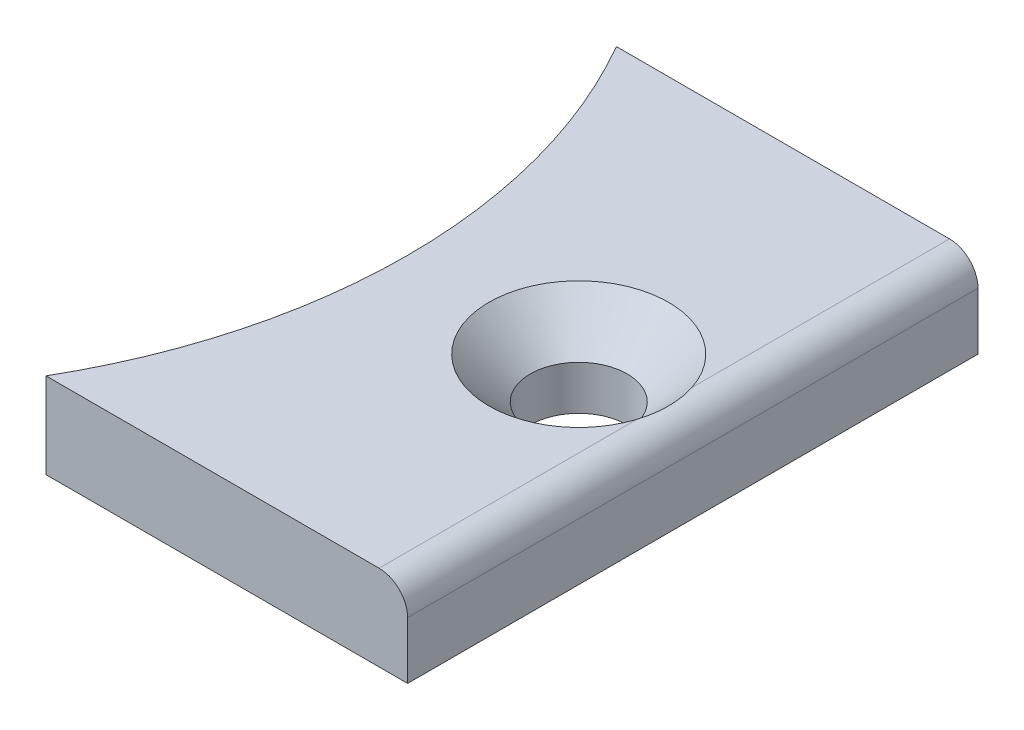
ISO-10303-21;
HEADER;
FILE_DESCRIPTION(('STEP AP214'),'2;1');
FILE_NAME('part.step','',(''),(''),'','','');
FILE_SCHEMA(('AUTOMOTIVE_DESIGN { 1 0 10303 214 1 1 1 1 }'));
ENDSEC;
DATA;
#1=APPLICATION_CONTEXT('core data for automotive mechanical design processes');
#2=APPLICATION_PROTOCOL_DEFINITION('international standard','automotive_design',2000,#1);
#3=PRODUCT_CONTEXT('',#1,'mechanical');
#4=PRODUCT('Part','Part','',(#3));
#5=PRODUCT_RELATED_PRODUCT_CATEGORY('part','',(#4));
#6=PRODUCT_DEFINITION_FORMATION('','',#4);
#7=PRODUCT_DEFINITION_CONTEXT('part definition',#1,'design');
#8=PRODUCT_DEFINITION('design','',#6,#7);
#9=PRODUCT_DEFINITION_SHAPE('','',#8);
#10=(LENGTH_UNIT() NAMED_UNIT(*) SI_UNIT(.MILLI.,.METRE.));
#11=(NAMED_UNIT(*) PLANE_ANGLE_UNIT() SI_UNIT($,.RADIAN.));
#12=(NAMED_UNIT(*) SI_UNIT($,.STERADIAN.) SOLID_ANGLE_UNIT());
#13=UNCERTAINTY_MEASURE_WITH_UNIT(LENGTH_MEASURE(1.E-05),#10,'distance_accuracy_value','');
#14=(GEOMETRIC_REPRESENTATION_CONTEXT(3) GLOBAL_UNCERTAINTY_ASSIGNED_CONTEXT((#13)) GLOBAL_UNIT_ASSIGNED_CONTEXT((#10,
#11,#12)) REPRESENTATION_CONTEXT('',''));
#15=CARTESIAN_POINT('',(0.,0.,0.));
#16=DIRECTION('',(0.,0.,1.));
#17=DIRECTION('',(1.,0.,0.));
#18=AXIS2_PLACEMENT_3D('',#15,#16,#17);
#19=CARTESIAN_POINT('',(-12.6794919243112,3.00000000000006,-10.));
#20=DIRECTION('',(0.,0.,1.));
#21=DIRECTION('',(1.,0.,0.));
#22=AXIS2_PLACEMENT_3D('',#19,#20,#21);
#23=PLANE('',#22);
#24=DIRECTION('',(-1.,0.,0.));
#25=VECTOR('',#24,1.);
#26=CARTESIAN_POINT('',(-12.6794919243112,3.00000000000006,-10.));
#27=LINE('',#26,#25);
#28=CARTESIAN_POINT('',(-0.999999999999973,3.,-10.));
#29=VERTEX_POINT('',#28);
#30=CARTESIAN_POINT('',(-12.6794919243112,3.00000000000006,-10.));
#31=VERTEX_POINT('',#30);
#32=EDGE_CURVE('E85',#29,#31,#27,.T.);
#33=ORIENTED_EDGE('',*,*,#32,.F.);
#34=CARTESIAN_POINT('',(-1.,2.,-10.));
#35=DIRECTION('',(0.,0.,1.));
#36=DIRECTION('',(1.,0.,0.));
#37=AXIS2_PLACEMENT_3D('',#34,#35,#36);
#38=CIRCLE('',#37,1.);
#39=CARTESIAN_POINT('',(0.,2.,-10.));
#40=VERTEX_POINT('',#39);
#41=EDGE_CURVE('E57',#29,#40,#38,.F.);
#42=ORIENTED_EDGE('',*,*,#41,.T.);
#43=DIRECTION('',(0.,-1.,0.));
#44=VECTOR('',#43,1.);
#45=CARTESIAN_POINT('',(0.,3.,-10.));
#46=LINE('',#45,#44);
#47=CARTESIAN_POINT('',(0.,0.,-10.));
#48=VERTEX_POINT('',#47);
#49=EDGE_CURVE('E210',#40,#48,#46,.T.);
#50=ORIENTED_EDGE('',*,*,#49,.T.);
#51=DIRECTION('',(-1.,0.,0.));
#52=VECTOR('',#51,1.);
#53=CARTESIAN_POINT('',(-12.6794919243112,0.,-10.));
#54=LINE('',#53,#52);
#55=CARTESIAN_POINT('',(-12.6794919243112,0.,-10.));
#56=VERTEX_POINT('',#55);
#57=EDGE_CURVE('E108',#48,#56,#54,.T.);
#58=ORIENTED_EDGE('',*,*,#57,.T.);
#59=DIRECTION('',(0.,-1.,0.));
#60=VECTOR('',#59,1.);
#61=CARTESIAN_POINT('',(-12.6794919243112,3.00000000000006,-10.));
#62=LINE('',#61,#60);
#63=EDGE_CURVE('E100',#31,#56,#62,.T.);
#64=ORIENTED_EDGE('',*,*,#63,.F.);
#65=EDGE_LOOP('',(#33,#42,#50,#58,#64));
#66=FACE_BOUND('',#65,.T.);
#67=ADVANCED_FACE('F34',(#66),#23,.F.);
#68=CARTESIAN_POINT('',(-30.,3.,0.));
#69=DIRECTION('',(0.,-1.,0.));
#70=DIRECTION('',(0.,0.,-1.));
#71=AXIS2_PLACEMENT_3D('',#68,#69,#70);
#72=CYLINDRICAL_SURFACE('',#71,20.);
#73=CARTESIAN_POINT('',(-30.,0.,0.));
#74=DIRECTION('',(0.,-1.,0.));
#75=DIRECTION('',(0.,0.,1.));
#76=AXIS2_PLACEMENT_3D('',#73,#74,#75);
#77=CIRCLE('',#76,20.);
#78=CARTESIAN_POINT('',(-12.6794919243112,0.,10.));
#79=VERTEX_POINT('',#78);
#80=EDGE_CURVE('E215',#56,#79,#77,.T.);
#81=ORIENTED_EDGE('',*,*,#80,.T.);
#82=DIRECTION('',(0.,-1.,0.));
#83=VECTOR('',#82,1.);
#84=CARTESIAN_POINT('',(-12.6794919243112,2.99999999999995,10.));
#85=LINE('',#84,#83);
#86=CARTESIAN_POINT('',(-12.6794919243112,2.99999999999995,10.));
#87=VERTEX_POINT('',#86);
#88=EDGE_CURVE('E103',#87,#79,#85,.T.);
#89=ORIENTED_EDGE('',*,*,#88,.F.);
#90=CARTESIAN_POINT('',(-30.,3.,0.));
#91=DIRECTION('',(0.,-1.,0.));
#92=DIRECTION('',(0.,0.,1.));
#93=AXIS2_PLACEMENT_3D('',#90,#91,#92);
#94=CIRCLE('',#93,20.);
#95=EDGE_CURVE('E89',#31,#87,#94,.T.);
#96=ORIENTED_EDGE('',*,*,#95,.F.);
#97=ORIENTED_EDGE('',*,*,#63,.T.);
#98=EDGE_LOOP('',(#81,#89,#96,#97));
#99=FACE_BOUND('',#98,.T.);
#100=ADVANCED_FACE('F99',(#99),#72,.F.);
#101=CARTESIAN_POINT('',(0.,3.,10.));
#102=DIRECTION('',(0.,0.,-1.));
#103=DIRECTION('',(-1.,0.,0.));
#104=AXIS2_PLACEMENT_3D('',#101,#102,#103);
#105=PLANE('',#104);
#106=DIRECTION('',(0.,-1.,0.));
#107=VECTOR('',#106,1.);
#108=CARTESIAN_POINT('',(0.,3.,10.));
#109=LINE('',#108,#107);
#110=CARTESIAN_POINT('',(0.,2.,10.));
#111=VERTEX_POINT('',#110);
#112=CARTESIAN_POINT('',(0.,0.,10.));
#113=VERTEX_POINT('',#112);
#114=EDGE_CURVE('E112',#111,#113,#109,.T.);
#115=ORIENTED_EDGE('',*,*,#114,.F.);
#116=CARTESIAN_POINT('',(-1.,2.,10.));
#117=DIRECTION('',(0.,0.,-1.));
#118=DIRECTION('',(-1.,0.,0.));
#119=AXIS2_PLACEMENT_3D('',#116,#117,#118);
#120=CIRCLE('',#119,1.);
#121=CARTESIAN_POINT('',(-1.,3.,10.));
#122=VERTEX_POINT('',#121);
#123=EDGE_CURVE('E11',#111,#122,#120,.F.);
#124=ORIENTED_EDGE('',*,*,#123,.T.);
#125=DIRECTION('',(1.,0.,0.));
#126=VECTOR('',#125,1.);
#127=CARTESIAN_POINT('',(0.,3.,10.));
#128=LINE('',#127,#126);
#129=EDGE_CURVE('E105',#87,#122,#128,.T.);
#130=ORIENTED_EDGE('',*,*,#129,.F.);
#131=ORIENTED_EDGE('',*,*,#88,.T.);
#132=DIRECTION('',(1.,0.,0.));
#133=VECTOR('',#132,1.);
#134=CARTESIAN_POINT('',(0.,0.,10.));
#135=LINE('',#134,#133);
#136=EDGE_CURVE('E218',#79,#113,#135,.T.);
#137=ORIENTED_EDGE('',*,*,#136,.T.);
#138=EDGE_LOOP('',(#115,#124,#130,#131,#137));
#139=FACE_BOUND('',#138,.T.);
#140=ADVANCED_FACE('F142',(#139),#105,.F.);
#141=CARTESIAN_POINT('',(0.,3.,-10.));
#142=DIRECTION('',(-1.,0.,0.));
#143=DIRECTION('',(0.,0.,1.));
#144=AXIS2_PLACEMENT_3D('',#141,#142,#143);
#145=PLANE('',#144);
#146=ORIENTED_EDGE('',*,*,#49,.F.);
#147=DIRECTION('',(0.,0.,-1.));
#148=VECTOR('',#147,1.);
#149=CARTESIAN_POINT('',(0.,2.,10.));
#150=LINE('',#149,#148);
#151=EDGE_CURVE('E43',#40,#111,#150,.F.);
#152=ORIENTED_EDGE('',*,*,#151,.T.);
#153=ORIENTED_EDGE('',*,*,#114,.T.);
#154=DIRECTION('',(0.,0.,-1.));
#155=VECTOR('',#154,1.);
#156=CARTESIAN_POINT('',(0.,0.,-10.));
#157=LINE('',#156,#155);
#158=EDGE_CURVE('E95',#113,#48,#157,.T.);
#159=ORIENTED_EDGE('',*,*,#158,.T.);
#160=EDGE_LOOP('',(#146,#152,#153,#159));
#161=FACE_BOUND('',#160,.T.);
#162=ADVANCED_FACE('F136',(#161),#145,.F.);
#163=CARTESIAN_POINT('',(-30.,3.,0.));
#164=DIRECTION('',(0.,1.,0.));
#165=DIRECTION('',(0.,0.,1.));
#166=AXIS2_PLACEMENT_3D('',#163,#164,#165);
#167=PLANE('',#166);
#168=ORIENTED_EDGE('',*,*,#129,.T.);
#169=DIRECTION('',(0.,0.,-1.));
#170=VECTOR('',#169,1.);
#171=CARTESIAN_POINT('',(-0.999999999999973,3.,-10.));
#172=LINE('',#171,#170);
#173=CARTESIAN_POINT('',(-1.,3.,0.960468635614932));
#174=VERTEX_POINT('',#173);
#175=EDGE_CURVE('E110',#122,#174,#172,.T.);
#176=ORIENTED_EDGE('',*,*,#175,.T.);
#177=CARTESIAN_POINT('',(-4.,2.99999999999995,0.));
#178=DIRECTION('',(0.,1.,0.));
#179=DIRECTION('',(0.,0.,1.));
#180=AXIS2_PLACEMENT_3D('',#177,#178,#179);
#181=CIRCLE('',#180,3.15);
#182=CARTESIAN_POINT('',(-1.,3.,-0.960468635614934));
#183=VERTEX_POINT('',#182);
#184=EDGE_CURVE('E229',#183,#174,#181,.T.);
#185=ORIENTED_EDGE('',*,*,#184,.F.);
#186=DIRECTION('',(0.,0.,-1.));
#187=VECTOR('',#186,1.);
#188=CARTESIAN_POINT('',(-0.999999999999973,3.,-10.));
#189=LINE('',#188,#187);
#190=EDGE_CURVE('E93',#183,#29,#189,.T.);
#191=ORIENTED_EDGE('',*,*,#190,.T.);
#192=ORIENTED_EDGE('',*,*,#32,.T.);
#193=ORIENTED_EDGE('',*,*,#95,.T.);
#194=EDGE_LOOP('',(#168,#176,#185,#191,#192,#193));
#195=FACE_BOUND('',#194,.T.);
#196=ADVANCED_FACE('F88',(#195),#167,.T.);
#197=CARTESIAN_POINT('',(-30.,0.,0.));
#198=DIRECTION('',(0.,1.,0.));
#199=DIRECTION('',(0.,0.,1.));
#200=AXIS2_PLACEMENT_3D('',#197,#198,#199);
#201=PLANE('',#200);
#202=CARTESIAN_POINT('',(-4.,0.,0.));
#203=DIRECTION('',(0.,1.,0.));
#204=DIRECTION('',(0.,0.,1.));
#205=AXIS2_PLACEMENT_3D('',#202,#203,#204);
#206=CIRCLE('',#205,1.7);
#207=CARTESIAN_POINT('',(-4.,0.,1.7));
#208=VERTEX_POINT('',#207);
#209=EDGE_CURVE('E216',#208,#208,#206,.T.);
#210=ORIENTED_EDGE('',*,*,#209,.T.);
#211=EDGE_LOOP('',(#210));
#212=FACE_BOUND('',#211,.T.);
#213=ORIENTED_EDGE('',*,*,#57,.F.);
#214=ORIENTED_EDGE('',*,*,#158,.F.);
#215=ORIENTED_EDGE('',*,*,#136,.F.);
#216=ORIENTED_EDGE('',*,*,#80,.F.);
#217=EDGE_LOOP('',(#213,#214,#215,#216));
#218=FACE_BOUND('',#217,.T.);
#219=ADVANCED_FACE('F132',(#212,#218),#201,.F.);
#220=CARTESIAN_POINT('',(-4.,2.99999999999995,0.));
#221=DIRECTION('',(0.,1.,0.));
#222=DIRECTION('',(0.,0.,1.));
#223=AXIS2_PLACEMENT_3D('',#220,#221,#222);
#224=CYLINDRICAL_SURFACE('',#223,1.7);
#225=ORIENTED_EDGE('',*,*,#209,.F.);
#226=EDGE_LOOP('',(#225));
#227=FACE_BOUND('',#226,.T.);
#228=CARTESIAN_POINT('',(-3.99999999999998,1.54999999999994,0.));
#229=DIRECTION('',(0.,1.,0.));
#230=DIRECTION('',(0.,0.,1.));
#231=AXIS2_PLACEMENT_3D('',#228,#229,#230);
#232=CIRCLE('',#231,1.7);
#233=CARTESIAN_POINT('',(-3.99999999999998,1.54999999999994,1.7));
#234=VERTEX_POINT('',#233);
#235=EDGE_CURVE('E225',#234,#234,#232,.T.);
#236=ORIENTED_EDGE('',*,*,#235,.T.);
#237=EDGE_LOOP('',(#236));
#238=FACE_BOUND('',#237,.T.);
#239=ADVANCED_FACE('F128',(#227,#238),#224,.F.);
#240=CARTESIAN_POINT('',(-4.,2.99999999999995,0.));
#241=DIRECTION('',(0.,1.,0.));
#242=DIRECTION('',(0.,0.,1.));
#243=AXIS2_PLACEMENT_3D('',#240,#241,#242);
#244=CONICAL_SURFACE('',#243,3.15,0.785398163397448);
#245=ORIENTED_EDGE('',*,*,#235,.F.);
#246=EDGE_LOOP('',(#245));
#247=FACE_BOUND('',#246,.T.);
#248=ORIENTED_EDGE('',*,*,#184,.T.);
#249=CARTESIAN_POINT('',(-1.,3.,0.960468635614932));
#250=CARTESIAN_POINT('',(-0.987593792211646,2.99999308135768,0.921695557713002));
#251=CARTESIAN_POINT('',(-0.976149384708153,2.99976976919117,0.882628551323426));
#252=CARTESIAN_POINT('',(-0.955055305992133,2.99904668278758,0.80402855363142));
#253=CARTESIAN_POINT('',(-0.945405016983553,2.9985470039525,0.764495727736619));
#254=CARTESIAN_POINT('',(-0.918966437766034,2.99686908431223,0.6454579944807));
#255=CARTESIAN_POINT('',(-0.90465461008928,2.99551101759448,0.565398754351106));
#256=CARTESIAN_POINT('',(-0.882227347455282,2.99310178544189,0.406104109201021));
#257=CARTESIAN_POINT('',(-0.87399147393644,2.99204492492447,0.326885210245359));
#258=CARTESIAN_POINT('',(-0.862912329651532,2.99057465315031,0.168023668340021));
#259=CARTESIAN_POINT('',(-0.860071982391531,2.9901615907502,0.0883808190993564));
#260=CARTESIAN_POINT('',(-0.859680360012458,2.99010638556503,-0.0723423162651956));
#261=CARTESIAN_POINT('',(-0.862224514273043,2.9904781519863,-0.15342285475179));
#262=CARTESIAN_POINT('',(-0.872893700941217,2.99190365790127,-0.315168041864815));
#263=CARTESIAN_POINT('',(-0.881015808535266,2.99295703997142,-0.395832886139045));
#264=CARTESIAN_POINT('',(-0.90340782370753,2.99539077262562,-0.558070388190178));
#265=CARTESIAN_POINT('',(-0.917804407815867,2.99677758119737,-0.639626040389038));
#266=CARTESIAN_POINT('',(-0.944540403582654,2.99850020556819,-0.760879274335239));
#267=CARTESIAN_POINT('',(-0.954318357740014,2.99901506278647,-0.801146242402408));
#268=CARTESIAN_POINT('',(-0.97573146082685,2.9997613068669,-0.881199902120482));
#269=CARTESIAN_POINT('',(-0.987367273296244,2.99999259219336,-0.920986416694391));
#270=CARTESIAN_POINT('',(-1.,3.,-0.960468635614934));
#271=B_SPLINE_CURVE_WITH_KNOTS('',3,(#249,#250,#251,#252,#253,#254,#255,#256,#257,#258,#259,
#260,#261,#262,#263,#264,#265,#266,#267,#268,#269,#270),.UNSPECIFIED.,.F.,.F.,(4,2,2,2,2,2,2,2,
2,2,4),(0.,0.122094478474047,0.244146836115708,0.487891197942843,0.726663688971965,
0.965565519365218,1.20873681942254,1.45178070926722,1.69997686031319,1.82425817826492,
1.94858398337813),.UNSPECIFIED.);
#272=EDGE_CURVE('E118',#174,#183,#271,.T.);
#273=ORIENTED_EDGE('',*,*,#272,.T.);
#274=EDGE_LOOP('',(#248,#273));
#275=FACE_BOUND('',#274,.T.);
#276=ADVANCED_FACE('F124',(#247,#275),#244,.F.);
#277=CARTESIAN_POINT('',(-1.,2.,0.));
#278=DIRECTION('',(0.,0.,1.));
#279=DIRECTION('',(1.,0.,0.));
#280=AXIS2_PLACEMENT_3D('',#277,#278,#279);
#281=CYLINDRICAL_SURFACE('',#280,1.);
#282=ORIENTED_EDGE('',*,*,#123,.F.);
#283=ORIENTED_EDGE('',*,*,#151,.F.);
#284=ORIENTED_EDGE('',*,*,#41,.F.);
#285=ORIENTED_EDGE('',*,*,#190,.F.);
#286=ORIENTED_EDGE('',*,*,#272,.F.);
#287=ORIENTED_EDGE('',*,*,#175,.F.);
#288=EDGE_LOOP('',(#282,#283,#284,#285,#286,#287));
#289=FACE_BOUND('',#288,.T.);
#290=ADVANCED_FACE('F36',(#289),#281,.T.);
#291=CLOSED_SHELL('',(#67,#100,#140,#162,#196,#219,#239,#276,#290));
#292=MANIFOLD_SOLID_BREP('B2',#291);
#293=ADVANCED_BREP_SHAPE_REPRESENTATION('',(#18,#292),#14);
#294=SHAPE_DEFINITION_REPRESENTATION(#9,#293);
ENDSEC;
END-ISO-10303-21;
